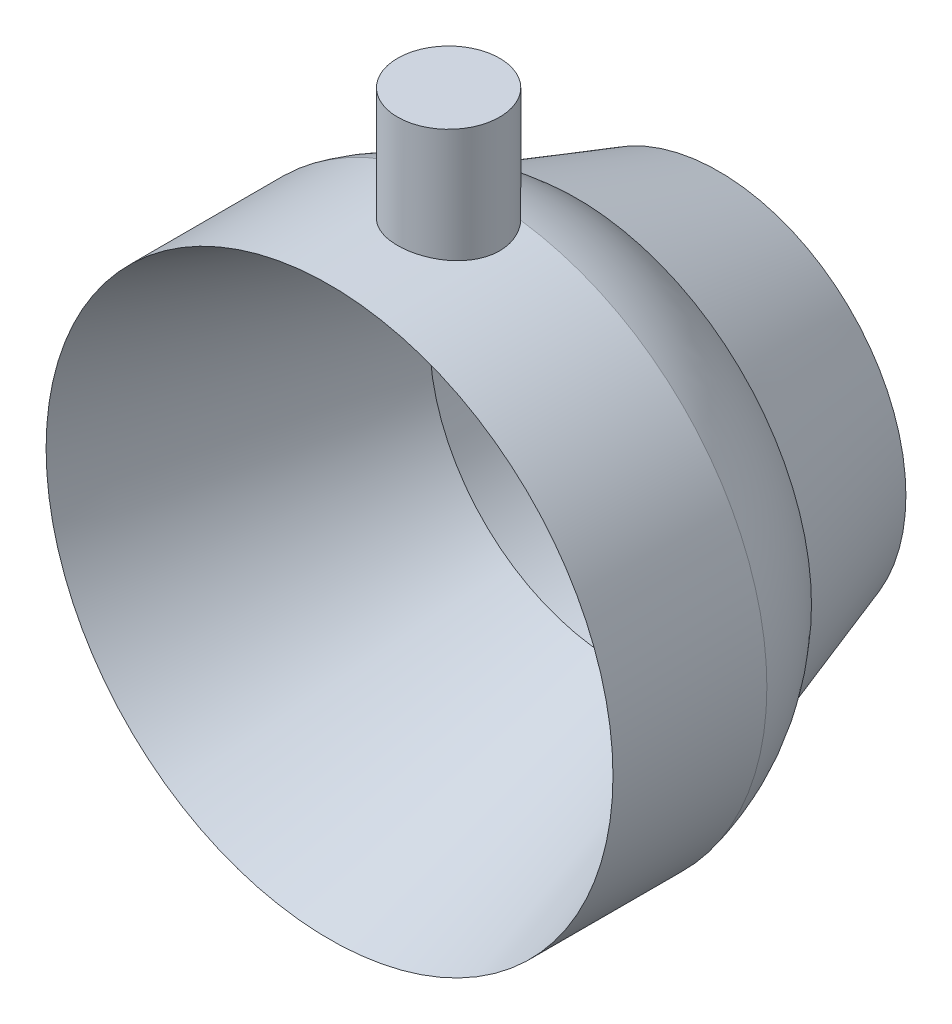
ISO-10303-21;
HEADER;
FILE_DESCRIPTION(('STEP AP214'),'2;1');
FILE_NAME('part.step','',(''),(''),'','','');
FILE_SCHEMA(('AUTOMOTIVE_DESIGN { 1 0 10303 214 1 1 1 1 }'));
ENDSEC;
DATA;
#1=APPLICATION_CONTEXT('core data for automotive mechanical design processes');
#2=APPLICATION_PROTOCOL_DEFINITION('international standard','automotive_design',2000,#1);
#3=PRODUCT_CONTEXT('',#1,'mechanical');
#4=PRODUCT('Part','Part','',(#3));
#5=PRODUCT_RELATED_PRODUCT_CATEGORY('part','',(#4));
#6=PRODUCT_DEFINITION_FORMATION('','',#4);
#7=PRODUCT_DEFINITION_CONTEXT('part definition',#1,'design');
#8=PRODUCT_DEFINITION('design','',#6,#7);
#9=PRODUCT_DEFINITION_SHAPE('','',#8);
#10=(LENGTH_UNIT() NAMED_UNIT(*) SI_UNIT(.MILLI.,.METRE.));
#11=(NAMED_UNIT(*) PLANE_ANGLE_UNIT() SI_UNIT($,.RADIAN.));
#12=(NAMED_UNIT(*) SI_UNIT($,.STERADIAN.) SOLID_ANGLE_UNIT());
#13=UNCERTAINTY_MEASURE_WITH_UNIT(LENGTH_MEASURE(1.E-05),#10,'distance_accuracy_value','');
#14=(GEOMETRIC_REPRESENTATION_CONTEXT(3) GLOBAL_UNCERTAINTY_ASSIGNED_CONTEXT((#13)) GLOBAL_UNIT_ASSIGNED_CONTEXT((#10,
#11,#12)) REPRESENTATION_CONTEXT('',''));
#15=CARTESIAN_POINT('',(0.,0.,0.));
#16=DIRECTION('',(0.,0.,1.));
#17=DIRECTION('',(1.,0.,0.));
#18=AXIS2_PLACEMENT_3D('',#15,#16,#17);
#19=CARTESIAN_POINT('',(0.,0.,0.));
#20=DIRECTION('',(0.,0.,1.));
#21=DIRECTION('',(1.,0.,0.));
#22=AXIS2_PLACEMENT_3D('',#19,#20,#21);
#23=CYLINDRICAL_SURFACE('',#22,16.6624418898531);
#24=CARTESIAN_POINT('',(0.,0.,16.8826560672794));
#25=DIRECTION('',(0.,0.,1.));
#26=DIRECTION('',(1.,0.,0.));
#27=AXIS2_PLACEMENT_3D('',#24,#25,#26);
#28=CIRCLE('',#27,16.6624418898531);
#29=CARTESIAN_POINT('',(16.6624418898531,0.,16.8826560672794));
#30=VERTEX_POINT('',#29);
#31=EDGE_CURVE('E51',#30,#30,#28,.T.);
#32=ORIENTED_EDGE('',*,*,#31,.F.);
#33=EDGE_LOOP('',(#32));
#34=FACE_BOUND('',#33,.T.);
#35=CARTESIAN_POINT('',(-2.19251514857845,16.5175617769689,7.83500440665594));
#36=CARTESIAN_POINT('',(-2.24987364866538,16.5099477732503,7.89641066737191));
#37=CARTESIAN_POINT('',(-2.30464253225792,16.5023740409719,7.96023674793747));
#38=CARTESIAN_POINT('',(-2.40865112608302,16.4875144376151,8.09227820795083));
#39=CARTESIAN_POINT('',(-2.45789075223057,16.4802285709155,8.16049365412416));
#40=CARTESIAN_POINT('',(-2.55048571623992,16.466152779404,8.30085644217735));
#41=CARTESIAN_POINT('',(-2.59384148708401,16.4593628181165,8.37300349418922));
#42=CARTESIAN_POINT('',(-2.67435603637906,16.4464721323395,8.52070719636581));
#43=CARTESIAN_POINT('',(-2.71151498769242,16.4403713886257,8.59626375134654));
#44=CARTESIAN_POINT('',(-2.81332222284425,16.4233668897038,8.82742437100977));
#45=CARTESIAN_POINT('',(-2.86830642715175,16.4137599915679,8.9875277963519));
#46=CARTESIAN_POINT('',(-2.9505856071552,16.3991699965913,9.31474111786496));
#47=CARTESIAN_POINT('',(-2.97789372478516,16.3941847052859,9.4818476493322));
#48=CARTESIAN_POINT('',(-3.0039129333891,16.3894372420291,9.81656759682148));
#49=CARTESIAN_POINT('',(-3.00292661957625,16.3896198021358,9.98415649597505));
#50=CARTESIAN_POINT('',(-2.97311780817387,16.3950530183661,10.3167795744278));
#51=CARTESIAN_POINT('',(-2.9442902656147,16.4003045930203,10.4818132852072));
#52=CARTESIAN_POINT('',(-2.85991811914789,16.4152259410235,10.8037507273042));
#53=CARTESIAN_POINT('',(-2.80451480362175,16.4248723361286,10.9606926465365));
#54=CARTESIAN_POINT('',(-2.66869186513996,16.4474851657277,11.2630760691113));
#55=CARTESIAN_POINT('',(-2.58827217960047,16.4604516085276,11.4085175436817));
#56=CARTESIAN_POINT('',(-2.40353917219252,16.4884436528507,11.6857318922499));
#57=CARTESIAN_POINT('',(-2.29894428343176,16.5034926077757,11.8173147630591));
#58=CARTESIAN_POINT('',(-2.06929908690831,16.5338548764578,12.0612017012466));
#59=CARTESIAN_POINT('',(-1.94424681460431,16.5491682154777,12.1735039149609));
#60=CARTESIAN_POINT('',(-1.67562577681334,16.5785302060192,12.3768396226193));
#61=CARTESIAN_POINT('',(-1.53187361187834,16.5925636133374,12.4676332959815));
#62=CARTESIAN_POINT('',(-1.2309033707881,16.617599624543,12.6237527532514));
#63=CARTESIAN_POINT('',(-1.07368608050314,16.6286024051502,12.6890800222309));
#64=CARTESIAN_POINT('',(-0.751414335137915,16.6462663253667,12.7919131733084));
#65=CARTESIAN_POINT('',(-0.58642446600235,16.6529581578084,12.8296160046845));
#66=CARTESIAN_POINT('',(-0.252337192178581,16.6613684572691,12.8767801119263));
#67=CARTESIAN_POINT('',(-0.083240164486459,16.6630873790248,12.8862439700451));
#68=CARTESIAN_POINT('',(0.251812170447359,16.6613701164586,12.8767000824518));
#69=CARTESIAN_POINT('',(0.417778955039288,16.6580036318578,12.8580772931484));
#70=CARTESIAN_POINT('',(0.744177998595559,16.6466166928188,12.7936476741918));
#71=CARTESIAN_POINT('',(0.904610229329464,16.6385962146454,12.7478407059002));
#72=CARTESIAN_POINT('',(1.21561414983966,16.618771804702,12.6303716246212));
#73=CARTESIAN_POINT('',(1.36617689115058,16.6069644951078,12.5586864212525));
#74=CARTESIAN_POINT('',(1.65322522214349,16.5808508867686,12.3915279186847));
#75=CARTESIAN_POINT('',(1.78970946300457,16.5665443489326,12.2960523431857));
#76=CARTESIAN_POINT('',(2.04676650469306,16.5367687040436,12.0824428033351));
#77=CARTESIAN_POINT('',(2.16708969454952,16.5212861212459,11.964010233583));
#78=CARTESIAN_POINT('',(2.38625099070803,16.4910595625958,11.7086140978774));
#79=CARTESIAN_POINT('',(2.4850885082247,16.4763156069929,11.5716500242604));
#80=CARTESIAN_POINT('',(2.65901602521389,16.4491466996867,11.2820580504987));
#81=CARTESIAN_POINT('',(2.73396262653728,16.4367359280597,11.1293425876274));
#82=CARTESIAN_POINT('',(2.8570667559807,16.4157871019015,10.8132133192953));
#83=CARTESIAN_POINT('',(2.90522531791056,16.4072488979216,10.6497999269634));
#84=CARTESIAN_POINT('',(2.97284781577619,16.3951311228265,10.3189490153006));
#85=CARTESIAN_POINT('',(2.99263986078804,16.3914948815486,10.1515806561851));
#86=CARTESIAN_POINT('',(3.00395373285178,16.3894255483036,9.81588309198774));
#87=CARTESIAN_POINT('',(2.99548065550484,16.3909915184882,9.64755406555569));
#88=CARTESIAN_POINT('',(2.95080036036488,16.3990926753508,9.31666791296591));
#89=CARTESIAN_POINT('',(2.9149030548818,16.4055723280976,9.15406738446618));
#90=CARTESIAN_POINT('',(2.81683266526701,16.4226942201346,8.8372082130623));
#91=CARTESIAN_POINT('',(2.75465668546349,16.433336918145,8.68295049157343));
#92=CARTESIAN_POINT('',(2.6160636160608,16.455922138466,8.40731418768508));
#93=CARTESIAN_POINT('',(2.54277050497175,16.4674860278661,8.28432822180084));
#94=CARTESIAN_POINT('',(2.42042573220924,16.4857576596915,8.10878061028603));
#95=CARTESIAN_POINT('',(2.37758354494671,16.4920015567397,8.05176071350071));
#96=CARTESIAN_POINT('',(2.28795640951236,16.5046742737985,7.94092144543368));
#97=CARTESIAN_POINT('',(2.24117109123556,16.5111031111304,7.88710237539421));
#98=CARTESIAN_POINT('',(2.19251514857845,16.5175617769689,7.83500440665594));
#99=B_SPLINE_CURVE_WITH_KNOTS('',3,(#35,#36,#37,#38,#39,#40,#41,#42,#43,#44,#45,#46,#47,#48,#49,
#50,#51,#52,#53,#54,#55,#56,#57,#58,#59,#60,#61,#62,#63,#64,#65,#66,#67,#68,#69,#70,#71,#72,#73,
#74,#75,#76,#77,#78,#79,#80,#81,#82,#83,#84,#85,#86,#87,#88,#89,#90,#91,#92,#93,#94,#95,#96,#97,
#98),.UNSPECIFIED.,.F.,.F.,(4,2,2,2,2,2,2,2,2,2,2,2,2,2,2,2,2,2,2,2,2,2,2,2,2,2,2,2,2,2,2,4),
(0.,0.253037891496531,0.506079630491589,0.759102738492851,1.01211878714668,1.51812095288561,
2.02388273177946,2.52423767057226,3.02468329319253,3.52249733027929,4.02031261276512,
4.52424743109816,5.02823067119289,5.53759349644868,6.04692661379773,6.55259211853528,
7.05821138234657,7.55696330936433,8.05571778002053,8.55491837892226,9.0541667604719,
9.56040714674435,10.0666614040921,10.5758994577434,11.0851178574056,11.588397345397,
12.0915861076906,12.589171104549,13.0868109450663,13.5161792488896,13.7308028283275,
13.945446574964),.UNSPECIFIED.);
#100=CARTESIAN_POINT('',(-2.19251514857845,16.5175617769689,7.83500440665594));
#101=VERTEX_POINT('',#100);
#102=CARTESIAN_POINT('',(2.19251514857845,16.5175617769689,7.83500440665594));
#103=VERTEX_POINT('',#102);
#104=EDGE_CURVE('E64',#101,#103,#99,.T.);
#105=ORIENTED_EDGE('',*,*,#104,.F.);
#106=CARTESIAN_POINT('',(0.,0.,7.83500440665594));
#107=DIRECTION('',(0.,0.,1.));
#108=DIRECTION('',(1.,0.,0.));
#109=AXIS2_PLACEMENT_3D('',#106,#107,#108);
#110=CIRCLE('',#109,16.6624418898531);
#111=EDGE_CURVE('E57',#101,#103,#110,.T.);
#112=ORIENTED_EDGE('',*,*,#111,.T.);
#113=EDGE_LOOP('',(#105,#112));
#114=FACE_BOUND('',#113,.T.);
#115=ADVANCED_FACE('F37',(#34,#114),#23,.T.);
#116=CARTESIAN_POINT('',(0.,0.,10.4134914452047));
#117=DIRECTION('',(0.,0.,1.));
#118=DIRECTION('',(1.,0.,0.));
#119=AXIS2_PLACEMENT_3D('',#116,#117,#118);
#120=DEGENERATE_TOROIDAL_SURFACE('',#119,5.03607066984403,11.9088665771944,.T.);
#121=CARTESIAN_POINT('',(0.,0.,2.35152077506814));
#122=DIRECTION('',(0.,0.,1.));
#123=DIRECTION('',(1.,0.,0.));
#124=AXIS2_PLACEMENT_3D('',#121,#122,#123);
#125=CIRCLE('',#124,13.8010995954823);
#126=CARTESIAN_POINT('',(13.8010995954823,0.,2.35152077506814));
#127=VERTEX_POINT('',#126);
#128=EDGE_CURVE('E62',#127,#127,#125,.T.);
#129=ORIENTED_EDGE('',*,*,#128,.T.);
#130=EDGE_LOOP('',(#129));
#131=FACE_BOUND('',#130,.T.);
#132=CARTESIAN_POINT('',(2.19270191713563,16.5175817276682,7.83520440665594));
#133=CARTESIAN_POINT('',(2.13523190664988,16.5114416859372,7.77364620996241));
#134=CARTESIAN_POINT('',(2.07515699732601,16.5053831894018,7.71451651036971));
#135=CARTESIAN_POINT('',(1.9502368583647,16.4935429662014,7.60150306166303));
#136=CARTESIAN_POINT('',(1.88539170877604,16.4877612348947,7.54761922455419));
#137=CARTESIAN_POINT('',(1.75140132095481,16.4765907351236,7.44550929439397));
#138=CARTESIAN_POINT('',(1.68225819728822,16.4712017762099,7.39728045232179));
#139=CARTESIAN_POINT('',(1.54015727600924,16.4609236408309,7.30680272900369));
#140=CARTESIAN_POINT('',(1.46719955431752,16.4560344544247,7.26455372880498));
#141=CARTESIAN_POINT('',(1.24324310992762,16.4422678994121,7.14720435817431));
#142=CARTESIAN_POINT('',(1.08712844470402,16.4342887482897,7.0814767607302));
#143=CARTESIAN_POINT('',(0.766079433404077,16.4214462494202,6.97720584826113));
#144=CARTESIAN_POINT('',(0.601147350161883,16.4165821063809,6.93865559433919));
#145=CARTESIAN_POINT('',(0.267908221120688,16.4104105204772,6.88992820570308));
#146=CARTESIAN_POINT('',(0.0996224467792192,16.4090852252158,6.87960864932565));
#147=CARTESIAN_POINT('',(-0.236297963633399,16.4100615755217,6.8872603702498));
#148=CARTESIAN_POINT('',(-0.403932567664631,16.4123633973457,6.90523302238794));
#149=CARTESIAN_POINT('',(-0.733133993874112,16.4203710459273,6.9688075999008));
#150=CARTESIAN_POINT('',(-0.894721237472133,16.4260640577986,7.01430552075831));
#151=CARTESIAN_POINT('',(-1.20795094024387,16.4403459818571,7.13150755134176));
#152=CARTESIAN_POINT('',(-1.35959364823246,16.4489348215569,7.20321100510314));
#153=CARTESIAN_POINT('',(-1.63166480473062,16.4671444473577,7.3608741171019));
#154=CARTESIAN_POINT('',(-1.7536650615619,16.4765238719562,7.44415313593045));
#155=CARTESIAN_POINT('',(-1.92638199028335,16.49141351932,7.58168192186059));
#156=CARTESIAN_POINT('',(-1.98224586644725,16.4965140818506,7.62963241815777));
#157=CARTESIAN_POINT('',(-2.09029619691925,16.5069158306229,7.72950210517668));
#158=CARTESIAN_POINT('',(-2.1424822860106,16.5122170367091,7.78142168897802));
#159=CARTESIAN_POINT('',(-2.19270191713563,16.5175817276682,7.83520440665594));
#160=B_SPLINE_CURVE_WITH_KNOTS('',3,(#132,#133,#134,#135,#136,#137,#138,#139,#140,#141,#142,
#143,#144,#145,#146,#147,#148,#149,#150,#151,#152,#153,#154,#155,#156,#157,#158,#159),
.UNSPECIFIED.,.F.,.F.,(4,2,2,2,2,2,2,2,2,2,2,2,2,4),(0.,0.253235806391247,0.506467364235795,
0.759575305602452,1.01267821136308,1.51876215913068,2.02471684711899,2.528114284537,
3.03153618489373,3.53306767832974,4.03458661852516,4.47692618881189,4.6981437469206,
4.91938324182005),.UNSPECIFIED.);
#161=EDGE_CURVE('E11',#103,#101,#160,.T.);
#162=ORIENTED_EDGE('',*,*,#161,.F.);
#163=ORIENTED_EDGE('',*,*,#111,.F.);
#164=EDGE_LOOP('',(#162,#163));
#165=FACE_BOUND('',#164,.T.);
#166=ADVANCED_FACE('F59',(#131,#165),#120,.T.);
#167=CARTESIAN_POINT('',(0.,0.,16.8826560672794));
#168=DIRECTION('',(0.,0.,1.));
#169=DIRECTION('',(1.,0.,0.));
#170=AXIS2_PLACEMENT_3D('',#167,#168,#169);
#171=CONICAL_SURFACE('',#170,16.6624418898531,0.323609348917242);
#172=CARTESIAN_POINT('',(0.,0.,0.));
#173=DIRECTION('',(0.,0.,1.));
#174=DIRECTION('',(1.,0.,0.));
#175=AXIS2_PLACEMENT_3D('',#172,#173,#174);
#176=CIRCLE('',#175,11.);
#177=CARTESIAN_POINT('',(11.,0.,0.));
#178=VERTEX_POINT('',#177);
#179=EDGE_CURVE('E66',#178,#178,#176,.T.);
#180=ORIENTED_EDGE('',*,*,#179,.F.);
#181=EDGE_LOOP('',(#180));
#182=FACE_BOUND('',#181,.T.);
#183=ORIENTED_EDGE('',*,*,#31,.T.);
#184=EDGE_LOOP('',(#183));
#185=FACE_BOUND('',#184,.T.);
#186=ADVANCED_FACE('F39',(#182,#185),#171,.F.);
#187=CARTESIAN_POINT('',(0.,0.,-6.));
#188=DIRECTION('',(0.,0.,1.));
#189=DIRECTION('',(1.,0.,0.));
#190=AXIS2_PLACEMENT_3D('',#187,#188,#189);
#191=CONICAL_SURFACE('',#190,11.,0.323609348917242);
#192=ORIENTED_EDGE('',*,*,#128,.F.);
#193=EDGE_LOOP('',(#192));
#194=FACE_BOUND('',#193,.T.);
#195=CARTESIAN_POINT('',(0.,0.,-6.));
#196=DIRECTION('',(0.,0.,1.));
#197=DIRECTION('',(1.,0.,0.));
#198=AXIS2_PLACEMENT_3D('',#195,#196,#197);
#199=CIRCLE('',#198,11.);
#200=CARTESIAN_POINT('',(11.,0.,-6.));
#201=VERTEX_POINT('',#200);
#202=EDGE_CURVE('E103',#201,#201,#199,.T.);
#203=ORIENTED_EDGE('',*,*,#202,.T.);
#204=EDGE_LOOP('',(#203));
#205=FACE_BOUND('',#204,.T.);
#206=ADVANCED_FACE('F80',(#194,#205),#191,.T.);
#207=CARTESIAN_POINT('',(0.,0.,0.));
#208=DIRECTION('',(0.,0.,1.));
#209=DIRECTION('',(1.,0.,0.));
#210=AXIS2_PLACEMENT_3D('',#207,#208,#209);
#211=CYLINDRICAL_SURFACE('',#210,11.);
#212=ORIENTED_EDGE('',*,*,#202,.F.);
#213=EDGE_LOOP('',(#212));
#214=FACE_BOUND('',#213,.T.);
#215=ORIENTED_EDGE('',*,*,#179,.T.);
#216=EDGE_LOOP('',(#215));
#217=FACE_BOUND('',#216,.T.);
#218=ADVANCED_FACE('F72',(#214,#217),#211,.F.);
#219=CARTESIAN_POINT('',(0.,23.2,9.88265606727939));
#220=DIRECTION('',(0.,-1.,0.));
#221=DIRECTION('',(0.,0.,-1.));
#222=AXIS2_PLACEMENT_3D('',#219,#220,#221);
#223=CYLINDRICAL_SURFACE('',#222,3.);
#224=CARTESIAN_POINT('',(0.,23.2,9.88265606727939));
#225=DIRECTION('',(0.,1.,0.));
#226=DIRECTION('',(0.,0.,1.));
#227=AXIS2_PLACEMENT_3D('',#224,#225,#226);
#228=CIRCLE('',#227,3.);
#229=CARTESIAN_POINT('',(0.,23.2,12.8826560672794));
#230=VERTEX_POINT('',#229);
#231=EDGE_CURVE('E67',#230,#230,#228,.T.);
#232=ORIENTED_EDGE('',*,*,#231,.F.);
#233=EDGE_LOOP('',(#232));
#234=FACE_BOUND('',#233,.T.);
#235=ORIENTED_EDGE('',*,*,#161,.T.);
#236=ORIENTED_EDGE('',*,*,#104,.T.);
#237=EDGE_LOOP('',(#235,#236));
#238=FACE_BOUND('',#237,.T.);
#239=ADVANCED_FACE('F69',(#234,#238),#223,.T.);
#240=CARTESIAN_POINT('',(0.,23.2,9.88265606727939));
#241=DIRECTION('',(0.,1.,0.));
#242=DIRECTION('',(0.,0.,1.));
#243=AXIS2_PLACEMENT_3D('',#240,#241,#242);
#244=PLANE('',#243);
#245=ORIENTED_EDGE('',*,*,#231,.T.);
#246=EDGE_LOOP('',(#245));
#247=FACE_BOUND('',#246,.T.);
#248=ADVANCED_FACE('F71',(#247),#244,.T.);
#249=CLOSED_SHELL('',(#115,#166,#186,#206,#218,#239,#248));
#250=MANIFOLD_SOLID_BREP('B2',#249);
#251=ADVANCED_BREP_SHAPE_REPRESENTATION('',(#18,#250),#14);
#252=SHAPE_DEFINITION_REPRESENTATION(#9,#251);
ENDSEC;
END-ISO-10303-21;
